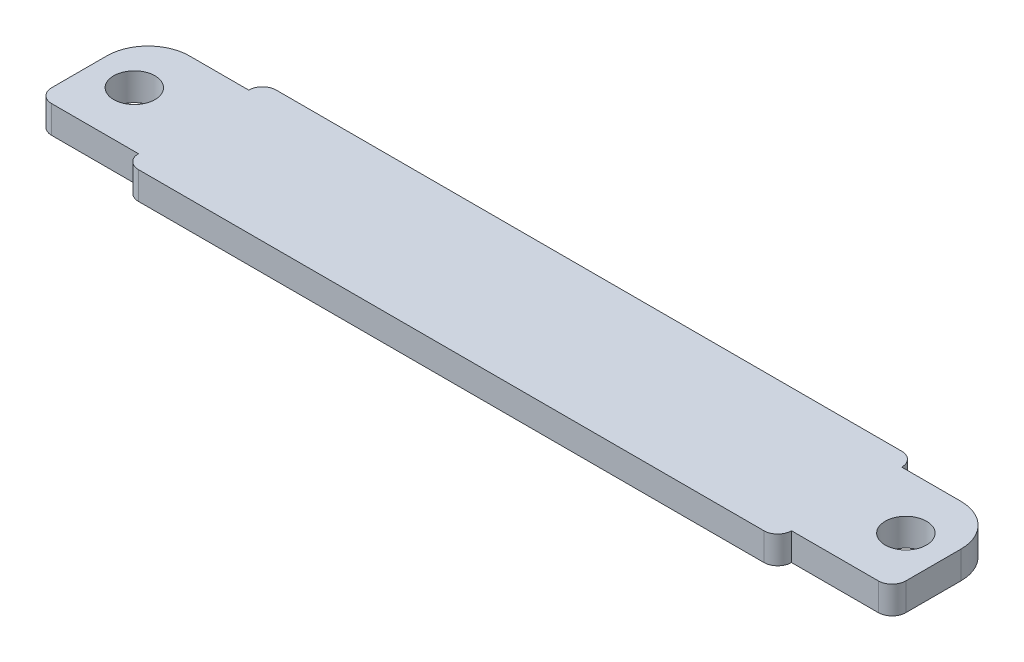
ISO-10303-21;
HEADER;
FILE_DESCRIPTION(('STEP AP214'),'2;1');
FILE_NAME('part.step','',(''),(''),'','','');
FILE_SCHEMA(('AUTOMOTIVE_DESIGN { 1 0 10303 214 1 1 1 1 }'));
ENDSEC;
DATA;
#1=APPLICATION_CONTEXT('core data for automotive mechanical design processes');
#2=APPLICATION_PROTOCOL_DEFINITION('international standard','automotive_design',2000,#1);
#3=PRODUCT_CONTEXT('',#1,'mechanical');
#4=PRODUCT('Part','Part','',(#3));
#5=PRODUCT_RELATED_PRODUCT_CATEGORY('part','',(#4));
#6=PRODUCT_DEFINITION_FORMATION('','',#4);
#7=PRODUCT_DEFINITION_CONTEXT('part definition',#1,'design');
#8=PRODUCT_DEFINITION('design','',#6,#7);
#9=PRODUCT_DEFINITION_SHAPE('','',#8);
#10=(LENGTH_UNIT() NAMED_UNIT(*) SI_UNIT(.MILLI.,.METRE.));
#11=(NAMED_UNIT(*) PLANE_ANGLE_UNIT() SI_UNIT($,.RADIAN.));
#12=(NAMED_UNIT(*) SI_UNIT($,.STERADIAN.) SOLID_ANGLE_UNIT());
#13=UNCERTAINTY_MEASURE_WITH_UNIT(LENGTH_MEASURE(1.E-05),#10,'distance_accuracy_value','');
#14=(GEOMETRIC_REPRESENTATION_CONTEXT(3) GLOBAL_UNCERTAINTY_ASSIGNED_CONTEXT((#13)) GLOBAL_UNIT_ASSIGNED_CONTEXT((#10,
#11,#12)) REPRESENTATION_CONTEXT('',''));
#15=CARTESIAN_POINT('',(0.,0.,0.));
#16=DIRECTION('',(0.,0.,1.));
#17=DIRECTION('',(1.,0.,0.));
#18=AXIS2_PLACEMENT_3D('',#15,#16,#17);
#19=CARTESIAN_POINT('',(0.,2.,0.));
#20=DIRECTION('',(0.,1.,0.));
#21=DIRECTION('',(0.,0.,1.));
#22=AXIS2_PLACEMENT_3D('',#19,#20,#21);
#23=PLANE('',#22);
#24=CARTESIAN_POINT('',(-28.05,2.,0.));
#25=DIRECTION('',(0.,1.,0.));
#26=DIRECTION('',(0.,0.,1.));
#27=AXIS2_PLACEMENT_3D('',#24,#25,#26);
#28=CIRCLE('',#27,1.5);
#29=CARTESIAN_POINT('',(-28.05,2.,1.50000000000001));
#30=VERTEX_POINT('',#29);
#31=EDGE_CURVE('E251',#30,#30,#28,.T.);
#32=ORIENTED_EDGE('',*,*,#31,.F.);
#33=EDGE_LOOP('',(#32));
#34=FACE_BOUND('',#33,.T.);
#35=DIRECTION('',(1.,0.,0.));
#36=VECTOR('',#35,1.);
#37=CARTESIAN_POINT('',(-31.05,2.,4.00000000000001));
#38=LINE('',#37,#36);
#39=CARTESIAN_POINT('',(-30.05,2.,4.00000000000001));
#40=VERTEX_POINT('',#39);
#41=CARTESIAN_POINT('',(-23.75,2.,4.00000000000001));
#42=VERTEX_POINT('',#41);
#43=EDGE_CURVE('E293',#40,#42,#38,.T.);
#44=ORIENTED_EDGE('',*,*,#43,.T.);
#45=CARTESIAN_POINT('',(-22.75,2.,4.));
#46=DIRECTION('',(0.,1.,0.));
#47=DIRECTION('',(0.,0.,1.));
#48=AXIS2_PLACEMENT_3D('',#45,#46,#47);
#49=CIRCLE('',#48,1.);
#50=CARTESIAN_POINT('',(-22.75,2.,5.));
#51=VERTEX_POINT('',#50);
#52=EDGE_CURVE('E158',#42,#51,#49,.T.);
#53=ORIENTED_EDGE('',*,*,#52,.T.);
#54=DIRECTION('',(1.,0.,0.));
#55=VECTOR('',#54,1.);
#56=CARTESIAN_POINT('',(-23.75,2.,5.));
#57=LINE('',#56,#55);
#58=CARTESIAN_POINT('',(22.65,2.,5.));
#59=VERTEX_POINT('',#58);
#60=EDGE_CURVE('E154',#51,#59,#57,.T.);
#61=ORIENTED_EDGE('',*,*,#60,.T.);
#62=CARTESIAN_POINT('',(22.65,2.,4.));
#63=DIRECTION('',(0.,1.,0.));
#64=DIRECTION('',(0.,0.,1.));
#65=AXIS2_PLACEMENT_3D('',#62,#63,#64);
#66=CIRCLE('',#65,1.);
#67=CARTESIAN_POINT('',(23.65,2.,4.));
#68=VERTEX_POINT('',#67);
#69=EDGE_CURVE('E148',#59,#68,#66,.T.);
#70=ORIENTED_EDGE('',*,*,#69,.T.);
#71=DIRECTION('',(1.,0.,0.));
#72=VECTOR('',#71,1.);
#73=CARTESIAN_POINT('',(30.95,2.,4.));
#74=LINE('',#73,#72);
#75=CARTESIAN_POINT('',(29.95,2.,4.));
#76=VERTEX_POINT('',#75);
#77=EDGE_CURVE('E151',#68,#76,#74,.T.);
#78=ORIENTED_EDGE('',*,*,#77,.T.);
#79=CARTESIAN_POINT('',(29.95,2.,3.));
#80=DIRECTION('',(0.,1.,0.));
#81=DIRECTION('',(0.,0.,1.));
#82=AXIS2_PLACEMENT_3D('',#79,#80,#81);
#83=CIRCLE('',#82,1.);
#84=CARTESIAN_POINT('',(30.95,2.,3.));
#85=VERTEX_POINT('',#84);
#86=EDGE_CURVE('E215',#76,#85,#83,.T.);
#87=ORIENTED_EDGE('',*,*,#86,.T.);
#88=DIRECTION('',(0.,0.,-1.));
#89=VECTOR('',#88,1.);
#90=CARTESIAN_POINT('',(30.95,2.,-4.));
#91=LINE('',#90,#89);
#92=CARTESIAN_POINT('',(30.95,2.,-1.));
#93=VERTEX_POINT('',#92);
#94=EDGE_CURVE('E166',#85,#93,#91,.T.);
#95=ORIENTED_EDGE('',*,*,#94,.T.);
#96=CARTESIAN_POINT('',(27.95,2.,-1.));
#97=DIRECTION('',(0.,1.,0.));
#98=DIRECTION('',(0.,0.,1.));
#99=AXIS2_PLACEMENT_3D('',#96,#97,#98);
#100=CIRCLE('',#99,3.);
#101=CARTESIAN_POINT('',(27.95,2.,-4.));
#102=VERTEX_POINT('',#101);
#103=EDGE_CURVE('E189',#93,#102,#100,.T.);
#104=ORIENTED_EDGE('',*,*,#103,.T.);
#105=DIRECTION('',(-1.,0.,0.));
#106=VECTOR('',#105,1.);
#107=CARTESIAN_POINT('',(30.95,2.,-4.));
#108=LINE('',#107,#106);
#109=CARTESIAN_POINT('',(23.65,2.,-4.));
#110=VERTEX_POINT('',#109);
#111=EDGE_CURVE('E300',#102,#110,#108,.T.);
#112=ORIENTED_EDGE('',*,*,#111,.T.);
#113=CARTESIAN_POINT('',(22.65,2.,-4.));
#114=DIRECTION('',(0.,1.,0.));
#115=DIRECTION('',(0.,0.,1.));
#116=AXIS2_PLACEMENT_3D('',#113,#114,#115);
#117=CIRCLE('',#116,1.);
#118=CARTESIAN_POINT('',(22.65,2.,-5.));
#119=VERTEX_POINT('',#118);
#120=EDGE_CURVE('E57',#110,#119,#117,.T.);
#121=ORIENTED_EDGE('',*,*,#120,.T.);
#122=DIRECTION('',(-1.,0.,0.));
#123=VECTOR('',#122,1.);
#124=CARTESIAN_POINT('',(-23.75,2.,-5.));
#125=LINE('',#124,#123);
#126=CARTESIAN_POINT('',(-22.75,2.,-5.));
#127=VERTEX_POINT('',#126);
#128=EDGE_CURVE('E296',#119,#127,#125,.T.);
#129=ORIENTED_EDGE('',*,*,#128,.T.);
#130=CARTESIAN_POINT('',(-22.75,2.,-4.));
#131=DIRECTION('',(0.,1.,0.));
#132=DIRECTION('',(0.,0.,1.));
#133=AXIS2_PLACEMENT_3D('',#130,#131,#132);
#134=CIRCLE('',#133,1.);
#135=CARTESIAN_POINT('',(-23.75,2.,-3.99999999999999));
#136=VERTEX_POINT('',#135);
#137=EDGE_CURVE('E219',#127,#136,#134,.T.);
#138=ORIENTED_EDGE('',*,*,#137,.T.);
#139=DIRECTION('',(-1.,0.,0.));
#140=VECTOR('',#139,1.);
#141=CARTESIAN_POINT('',(-31.05,2.,-3.99999999999999));
#142=LINE('',#141,#140);
#143=CARTESIAN_POINT('',(-28.05,2.,-3.99999999999999));
#144=VERTEX_POINT('',#143);
#145=EDGE_CURVE('E277',#136,#144,#142,.T.);
#146=ORIENTED_EDGE('',*,*,#145,.T.);
#147=CARTESIAN_POINT('',(-28.05,2.,-0.999999999999993));
#148=DIRECTION('',(0.,1.,0.));
#149=DIRECTION('',(0.,0.,1.));
#150=AXIS2_PLACEMENT_3D('',#147,#148,#149);
#151=CIRCLE('',#150,3.);
#152=CARTESIAN_POINT('',(-31.05,2.,-0.999999999999993));
#153=VERTEX_POINT('',#152);
#154=EDGE_CURVE('E191',#144,#153,#151,.T.);
#155=ORIENTED_EDGE('',*,*,#154,.T.);
#156=DIRECTION('',(0.,0.,1.));
#157=VECTOR('',#156,1.);
#158=CARTESIAN_POINT('',(-31.05,2.,-3.99999999999999));
#159=LINE('',#158,#157);
#160=CARTESIAN_POINT('',(-31.05,2.,3.00000000000001));
#161=VERTEX_POINT('',#160);
#162=EDGE_CURVE('E291',#153,#161,#159,.T.);
#163=ORIENTED_EDGE('',*,*,#162,.T.);
#164=CARTESIAN_POINT('',(-30.05,2.,3.00000000000001));
#165=DIRECTION('',(0.,1.,0.));
#166=DIRECTION('',(0.,0.,1.));
#167=AXIS2_PLACEMENT_3D('',#164,#165,#166);
#168=CIRCLE('',#167,1.);
#169=EDGE_CURVE('E217',#161,#40,#168,.T.);
#170=ORIENTED_EDGE('',*,*,#169,.T.);
#171=EDGE_LOOP('',(#44,#53,#61,#70,#78,#87,#95,#104,#112,#121,#129,#138,#146,#155,#163,#170));
#172=FACE_BOUND('',#171,.T.);
#173=CARTESIAN_POINT('',(27.95,2.,0.));
#174=DIRECTION('',(0.,1.,0.));
#175=DIRECTION('',(0.,0.,1.));
#176=AXIS2_PLACEMENT_3D('',#173,#174,#175);
#177=CIRCLE('',#176,1.5);
#178=CARTESIAN_POINT('',(27.95,2.,1.5));
#179=VERTEX_POINT('',#178);
#180=EDGE_CURVE('E306',#179,#179,#177,.T.);
#181=ORIENTED_EDGE('',*,*,#180,.F.);
#182=EDGE_LOOP('',(#181));
#183=FACE_BOUND('',#182,.T.);
#184=ADVANCED_FACE('F35',(#34,#172,#183),#23,.T.);
#185=CARTESIAN_POINT('',(0.,0.,0.));
#186=DIRECTION('',(0.,1.,0.));
#187=DIRECTION('',(0.,0.,1.));
#188=AXIS2_PLACEMENT_3D('',#185,#186,#187);
#189=PLANE('',#188);
#190=DIRECTION('',(1.,0.,0.));
#191=VECTOR('',#190,1.);
#192=CARTESIAN_POINT('',(-23.75,0.,5.));
#193=LINE('',#192,#191);
#194=CARTESIAN_POINT('',(-22.75,0.,5.));
#195=VERTEX_POINT('',#194);
#196=CARTESIAN_POINT('',(22.65,0.,5.));
#197=VERTEX_POINT('',#196);
#198=EDGE_CURVE('E167',#195,#197,#193,.T.);
#199=ORIENTED_EDGE('',*,*,#198,.F.);
#200=CARTESIAN_POINT('',(-22.75,0.,4.));
#201=DIRECTION('',(0.,1.,0.));
#202=DIRECTION('',(0.,0.,1.));
#203=AXIS2_PLACEMENT_3D('',#200,#201,#202);
#204=CIRCLE('',#203,1.);
#205=CARTESIAN_POINT('',(-23.75,0.,4.00000000000001));
#206=VERTEX_POINT('',#205);
#207=EDGE_CURVE('E213',#195,#206,#204,.F.);
#208=ORIENTED_EDGE('',*,*,#207,.T.);
#209=DIRECTION('',(1.,0.,0.));
#210=VECTOR('',#209,1.);
#211=CARTESIAN_POINT('',(-31.05,0.,4.00000000000001));
#212=LINE('',#211,#210);
#213=CARTESIAN_POINT('',(-30.05,0.,4.00000000000001));
#214=VERTEX_POINT('',#213);
#215=EDGE_CURVE('E262',#214,#206,#212,.T.);
#216=ORIENTED_EDGE('',*,*,#215,.F.);
#217=CARTESIAN_POINT('',(-30.05,0.,3.00000000000001));
#218=DIRECTION('',(0.,1.,0.));
#219=DIRECTION('',(0.,0.,1.));
#220=AXIS2_PLACEMENT_3D('',#217,#218,#219);
#221=CIRCLE('',#220,1.);
#222=CARTESIAN_POINT('',(-31.05,0.,3.00000000000001));
#223=VERTEX_POINT('',#222);
#224=EDGE_CURVE('E206',#214,#223,#221,.F.);
#225=ORIENTED_EDGE('',*,*,#224,.T.);
#226=DIRECTION('',(0.,0.,1.));
#227=VECTOR('',#226,1.);
#228=CARTESIAN_POINT('',(-31.05,0.,-3.99999999999999));
#229=LINE('',#228,#227);
#230=CARTESIAN_POINT('',(-31.05,0.,-0.999999999999993));
#231=VERTEX_POINT('',#230);
#232=EDGE_CURVE('E259',#231,#223,#229,.T.);
#233=ORIENTED_EDGE('',*,*,#232,.F.);
#234=CARTESIAN_POINT('',(-28.05,0.,-0.999999999999993));
#235=DIRECTION('',(0.,1.,0.));
#236=DIRECTION('',(0.,0.,1.));
#237=AXIS2_PLACEMENT_3D('',#234,#235,#236);
#238=CIRCLE('',#237,3.);
#239=CARTESIAN_POINT('',(-28.05,0.,-3.99999999999999));
#240=VERTEX_POINT('',#239);
#241=EDGE_CURVE('E185',#231,#240,#238,.F.);
#242=ORIENTED_EDGE('',*,*,#241,.T.);
#243=DIRECTION('',(-1.,0.,0.));
#244=VECTOR('',#243,1.);
#245=CARTESIAN_POINT('',(-31.05,0.,-3.99999999999999));
#246=LINE('',#245,#244);
#247=CARTESIAN_POINT('',(-23.75,0.,-3.99999999999999));
#248=VERTEX_POINT('',#247);
#249=EDGE_CURVE('E256',#248,#240,#246,.T.);
#250=ORIENTED_EDGE('',*,*,#249,.F.);
#251=CARTESIAN_POINT('',(-22.75,0.,-4.));
#252=DIRECTION('',(0.,1.,0.));
#253=DIRECTION('',(0.,0.,1.));
#254=AXIS2_PLACEMENT_3D('',#251,#252,#253);
#255=CIRCLE('',#254,1.);
#256=CARTESIAN_POINT('',(-22.75,0.,-5.));
#257=VERTEX_POINT('',#256);
#258=EDGE_CURVE('E208',#248,#257,#255,.F.);
#259=ORIENTED_EDGE('',*,*,#258,.T.);
#260=DIRECTION('',(-1.,0.,0.));
#261=VECTOR('',#260,1.);
#262=CARTESIAN_POINT('',(-23.75,0.,-5.));
#263=LINE('',#262,#261);
#264=CARTESIAN_POINT('',(22.65,0.,-5.));
#265=VERTEX_POINT('',#264);
#266=EDGE_CURVE('E249',#265,#257,#263,.T.);
#267=ORIENTED_EDGE('',*,*,#266,.F.);
#268=CARTESIAN_POINT('',(22.65,0.,-4.));
#269=DIRECTION('',(0.,1.,0.));
#270=DIRECTION('',(0.,0.,1.));
#271=AXIS2_PLACEMENT_3D('',#268,#269,#270);
#272=CIRCLE('',#271,1.);
#273=CARTESIAN_POINT('',(23.65,0.,-4.));
#274=VERTEX_POINT('',#273);
#275=EDGE_CURVE('E210',#265,#274,#272,.F.);
#276=ORIENTED_EDGE('',*,*,#275,.T.);
#277=DIRECTION('',(-1.,0.,0.));
#278=VECTOR('',#277,1.);
#279=CARTESIAN_POINT('',(30.95,0.,-4.));
#280=LINE('',#279,#278);
#281=CARTESIAN_POINT('',(27.95,0.,-4.));
#282=VERTEX_POINT('',#281);
#283=EDGE_CURVE('E245',#282,#274,#280,.T.);
#284=ORIENTED_EDGE('',*,*,#283,.F.);
#285=CARTESIAN_POINT('',(27.95,0.,-1.));
#286=DIRECTION('',(0.,1.,0.));
#287=DIRECTION('',(0.,0.,1.));
#288=AXIS2_PLACEMENT_3D('',#285,#286,#287);
#289=CIRCLE('',#288,3.);
#290=CARTESIAN_POINT('',(30.95,0.,-1.));
#291=VERTEX_POINT('',#290);
#292=EDGE_CURVE('E176',#282,#291,#289,.F.);
#293=ORIENTED_EDGE('',*,*,#292,.T.);
#294=DIRECTION('',(0.,0.,-1.));
#295=VECTOR('',#294,1.);
#296=CARTESIAN_POINT('',(30.95,0.,-4.));
#297=LINE('',#296,#295);
#298=CARTESIAN_POINT('',(30.95,0.,3.));
#299=VERTEX_POINT('',#298);
#300=EDGE_CURVE('E237',#299,#291,#297,.T.);
#301=ORIENTED_EDGE('',*,*,#300,.F.);
#302=CARTESIAN_POINT('',(29.95,0.,3.));
#303=DIRECTION('',(0.,1.,0.));
#304=DIRECTION('',(0.,0.,1.));
#305=AXIS2_PLACEMENT_3D('',#302,#303,#304);
#306=CIRCLE('',#305,1.);
#307=CARTESIAN_POINT('',(29.95,0.,4.));
#308=VERTEX_POINT('',#307);
#309=EDGE_CURVE('E204',#299,#308,#306,.F.);
#310=ORIENTED_EDGE('',*,*,#309,.T.);
#311=DIRECTION('',(1.,0.,0.));
#312=VECTOR('',#311,1.);
#313=CARTESIAN_POINT('',(30.95,0.,4.));
#314=LINE('',#313,#312);
#315=CARTESIAN_POINT('',(23.65,0.,4.));
#316=VERTEX_POINT('',#315);
#317=EDGE_CURVE('E246',#316,#308,#314,.T.);
#318=ORIENTED_EDGE('',*,*,#317,.F.);
#319=CARTESIAN_POINT('',(22.65,0.,4.));
#320=DIRECTION('',(0.,1.,0.));
#321=DIRECTION('',(0.,0.,1.));
#322=AXIS2_PLACEMENT_3D('',#319,#320,#321);
#323=CIRCLE('',#322,1.);
#324=EDGE_CURVE('E170',#316,#197,#323,.F.);
#325=ORIENTED_EDGE('',*,*,#324,.T.);
#326=EDGE_LOOP('',(#199,#208,#216,#225,#233,#242,#250,#259,#267,#276,#284,#293,#301,#310,#318,#325));
#327=FACE_BOUND('',#326,.T.);
#328=CARTESIAN_POINT('',(-28.05,0.,0.));
#329=DIRECTION('',(0.,1.,0.));
#330=DIRECTION('',(0.,0.,1.));
#331=AXIS2_PLACEMENT_3D('',#328,#329,#330);
#332=CIRCLE('',#331,1.5);
#333=CARTESIAN_POINT('',(-28.05,0.,1.50000000000001));
#334=VERTEX_POINT('',#333);
#335=EDGE_CURVE('E303',#334,#334,#332,.T.);
#336=ORIENTED_EDGE('',*,*,#335,.T.);
#337=EDGE_LOOP('',(#336));
#338=FACE_BOUND('',#337,.T.);
#339=CARTESIAN_POINT('',(27.95,0.,0.));
#340=DIRECTION('',(0.,1.,0.));
#341=DIRECTION('',(0.,0.,1.));
#342=AXIS2_PLACEMENT_3D('',#339,#340,#341);
#343=CIRCLE('',#342,1.5);
#344=CARTESIAN_POINT('',(27.95,0.,1.5));
#345=VERTEX_POINT('',#344);
#346=EDGE_CURVE('E309',#345,#345,#343,.T.);
#347=ORIENTED_EDGE('',*,*,#346,.T.);
#348=EDGE_LOOP('',(#347));
#349=FACE_BOUND('',#348,.T.);
#350=ADVANCED_FACE('F241',(#327,#338,#349),#189,.F.);
#351=CARTESIAN_POINT('',(30.95,2.,4.));
#352=DIRECTION('',(0.,0.,-1.));
#353=DIRECTION('',(-1.,0.,0.));
#354=AXIS2_PLACEMENT_3D('',#351,#352,#353);
#355=PLANE('',#354);
#356=ORIENTED_EDGE('',*,*,#317,.T.);
#357=DIRECTION('',(0.,-1.,0.));
#358=VECTOR('',#357,1.);
#359=CARTESIAN_POINT('',(29.95,2.,4.));
#360=LINE('',#359,#358);
#361=EDGE_CURVE('E11',#308,#76,#360,.F.);
#362=ORIENTED_EDGE('',*,*,#361,.T.);
#363=ORIENTED_EDGE('',*,*,#77,.F.);
#364=DIRECTION('',(0.,-1.,0.));
#365=VECTOR('',#364,1.);
#366=CARTESIAN_POINT('',(23.65,2.,4.));
#367=LINE('',#366,#365);
#368=EDGE_CURVE('E164',#68,#316,#367,.T.);
#369=ORIENTED_EDGE('',*,*,#368,.T.);
#370=EDGE_LOOP('',(#356,#362,#363,#369));
#371=FACE_BOUND('',#370,.T.);
#372=ADVANCED_FACE('F163',(#371),#355,.F.);
#373=CARTESIAN_POINT('',(30.95,2.,-4.));
#374=DIRECTION('',(-1.,0.,0.));
#375=DIRECTION('',(0.,0.,1.));
#376=AXIS2_PLACEMENT_3D('',#373,#374,#375);
#377=PLANE('',#376);
#378=ORIENTED_EDGE('',*,*,#94,.F.);
#379=DIRECTION('',(0.,-1.,0.));
#380=VECTOR('',#379,1.);
#381=CARTESIAN_POINT('',(30.95,2.,3.));
#382=LINE('',#381,#380);
#383=EDGE_CURVE('E43',#85,#299,#382,.T.);
#384=ORIENTED_EDGE('',*,*,#383,.T.);
#385=ORIENTED_EDGE('',*,*,#300,.T.);
#386=DIRECTION('',(0.,-1.,0.));
#387=VECTOR('',#386,1.);
#388=CARTESIAN_POINT('',(30.95,2.,-1.));
#389=LINE('',#388,#387);
#390=EDGE_CURVE('E196',#291,#93,#389,.F.);
#391=ORIENTED_EDGE('',*,*,#390,.T.);
#392=EDGE_LOOP('',(#378,#384,#385,#391));
#393=FACE_BOUND('',#392,.T.);
#394=ADVANCED_FACE('F236',(#393),#377,.F.);
#395=CARTESIAN_POINT('',(30.95,2.,-4.));
#396=DIRECTION('',(0.,0.,1.));
#397=DIRECTION('',(1.,0.,0.));
#398=AXIS2_PLACEMENT_3D('',#395,#396,#397);
#399=PLANE('',#398);
#400=ORIENTED_EDGE('',*,*,#111,.F.);
#401=DIRECTION('',(0.,-1.,0.));
#402=VECTOR('',#401,1.);
#403=CARTESIAN_POINT('',(27.95,2.,-4.));
#404=LINE('',#403,#402);
#405=EDGE_CURVE('E193',#102,#282,#404,.T.);
#406=ORIENTED_EDGE('',*,*,#405,.T.);
#407=ORIENTED_EDGE('',*,*,#283,.T.);
#408=DIRECTION('',(0.,-1.,0.));
#409=VECTOR('',#408,1.);
#410=CARTESIAN_POINT('',(23.65,2.,-4.));
#411=LINE('',#410,#409);
#412=EDGE_CURVE('E173',#110,#274,#411,.T.);
#413=ORIENTED_EDGE('',*,*,#412,.F.);
#414=EDGE_LOOP('',(#400,#406,#407,#413));
#415=FACE_BOUND('',#414,.T.);
#416=ADVANCED_FACE('F344',(#415),#399,.F.);
#417=CARTESIAN_POINT('',(-23.75,2.,-5.));
#418=DIRECTION('',(0.,0.,1.));
#419=DIRECTION('',(1.,0.,0.));
#420=AXIS2_PLACEMENT_3D('',#417,#418,#419);
#421=PLANE('',#420);
#422=ORIENTED_EDGE('',*,*,#128,.F.);
#423=DIRECTION('',(0.,-1.,0.));
#424=VECTOR('',#423,1.);
#425=CARTESIAN_POINT('',(22.65,2.,-5.));
#426=LINE('',#425,#424);
#427=EDGE_CURVE('E224',#119,#265,#426,.T.);
#428=ORIENTED_EDGE('',*,*,#427,.T.);
#429=ORIENTED_EDGE('',*,*,#266,.T.);
#430=DIRECTION('',(0.,-1.,0.));
#431=VECTOR('',#430,1.);
#432=CARTESIAN_POINT('',(-22.75,2.,-5.));
#433=LINE('',#432,#431);
#434=EDGE_CURVE('E50',#257,#127,#433,.F.);
#435=ORIENTED_EDGE('',*,*,#434,.T.);
#436=EDGE_LOOP('',(#422,#428,#429,#435));
#437=FACE_BOUND('',#436,.T.);
#438=ADVANCED_FACE('F341',(#437),#421,.F.);
#439=CARTESIAN_POINT('',(-31.05,2.,-3.99999999999999));
#440=DIRECTION('',(0.,0.,1.));
#441=DIRECTION('',(1.,0.,0.));
#442=AXIS2_PLACEMENT_3D('',#439,#440,#441);
#443=PLANE('',#442);
#444=ORIENTED_EDGE('',*,*,#249,.T.);
#445=DIRECTION('',(0.,-1.,0.));
#446=VECTOR('',#445,1.);
#447=CARTESIAN_POINT('',(-28.05,2.,-3.99999999999999));
#448=LINE('',#447,#446);
#449=EDGE_CURVE('E187',#240,#144,#448,.F.);
#450=ORIENTED_EDGE('',*,*,#449,.T.);
#451=ORIENTED_EDGE('',*,*,#145,.F.);
#452=DIRECTION('',(0.,-1.,0.));
#453=VECTOR('',#452,1.);
#454=CARTESIAN_POINT('',(-23.75,2.,-3.99999999999999));
#455=LINE('',#454,#453);
#456=EDGE_CURVE('E179',#136,#248,#455,.T.);
#457=ORIENTED_EDGE('',*,*,#456,.T.);
#458=EDGE_LOOP('',(#444,#450,#451,#457));
#459=FACE_BOUND('',#458,.T.);
#460=ADVANCED_FACE('F274',(#459),#443,.F.);
#461=CARTESIAN_POINT('',(-31.05,2.,-3.99999999999999));
#462=DIRECTION('',(1.,0.,0.));
#463=DIRECTION('',(0.,0.,-1.));
#464=AXIS2_PLACEMENT_3D('',#461,#462,#463);
#465=PLANE('',#464);
#466=ORIENTED_EDGE('',*,*,#232,.T.);
#467=DIRECTION('',(0.,-1.,0.));
#468=VECTOR('',#467,1.);
#469=CARTESIAN_POINT('',(-31.05,2.,3.00000000000001));
#470=LINE('',#469,#468);
#471=EDGE_CURVE('E230',#223,#161,#470,.F.);
#472=ORIENTED_EDGE('',*,*,#471,.T.);
#473=ORIENTED_EDGE('',*,*,#162,.F.);
#474=DIRECTION('',(0.,-1.,0.));
#475=VECTOR('',#474,1.);
#476=CARTESIAN_POINT('',(-31.05,2.,-0.999999999999993));
#477=LINE('',#476,#475);
#478=EDGE_CURVE('E172',#153,#231,#477,.T.);
#479=ORIENTED_EDGE('',*,*,#478,.T.);
#480=EDGE_LOOP('',(#466,#472,#473,#479));
#481=FACE_BOUND('',#480,.T.);
#482=ADVANCED_FACE('F288',(#481),#465,.F.);
#483=CARTESIAN_POINT('',(-31.05,2.,4.00000000000001));
#484=DIRECTION('',(0.,0.,-1.));
#485=DIRECTION('',(-1.,0.,0.));
#486=AXIS2_PLACEMENT_3D('',#483,#484,#485);
#487=PLANE('',#486);
#488=ORIENTED_EDGE('',*,*,#43,.F.);
#489=DIRECTION('',(0.,-1.,0.));
#490=VECTOR('',#489,1.);
#491=CARTESIAN_POINT('',(-30.05,2.,4.00000000000001));
#492=LINE('',#491,#490);
#493=EDGE_CURVE('E227',#40,#214,#492,.T.);
#494=ORIENTED_EDGE('',*,*,#493,.T.);
#495=ORIENTED_EDGE('',*,*,#215,.T.);
#496=DIRECTION('',(0.,-1.,0.));
#497=VECTOR('',#496,1.);
#498=CARTESIAN_POINT('',(-23.75,2.,4.00000000000001));
#499=LINE('',#498,#497);
#500=EDGE_CURVE('E267',#42,#206,#499,.T.);
#501=ORIENTED_EDGE('',*,*,#500,.F.);
#502=EDGE_LOOP('',(#488,#494,#495,#501));
#503=FACE_BOUND('',#502,.T.);
#504=ADVANCED_FACE('F332',(#503),#487,.F.);
#505=CARTESIAN_POINT('',(-23.75,2.,5.));
#506=DIRECTION('',(0.,0.,-1.));
#507=DIRECTION('',(-1.,0.,0.));
#508=AXIS2_PLACEMENT_3D('',#505,#506,#507);
#509=PLANE('',#508);
#510=ORIENTED_EDGE('',*,*,#60,.F.);
#511=DIRECTION('',(0.,-1.,0.));
#512=VECTOR('',#511,1.);
#513=CARTESIAN_POINT('',(-22.75,2.,5.));
#514=LINE('',#513,#512);
#515=EDGE_CURVE('E201',#51,#195,#514,.T.);
#516=ORIENTED_EDGE('',*,*,#515,.T.);
#517=ORIENTED_EDGE('',*,*,#198,.T.);
#518=DIRECTION('',(0.,-1.,0.));
#519=VECTOR('',#518,1.);
#520=CARTESIAN_POINT('',(22.65,2.,5.));
#521=LINE('',#520,#519);
#522=EDGE_CURVE('E199',#197,#59,#521,.F.);
#523=ORIENTED_EDGE('',*,*,#522,.T.);
#524=EDGE_LOOP('',(#510,#516,#517,#523));
#525=FACE_BOUND('',#524,.T.);
#526=ADVANCED_FACE('F329',(#525),#509,.F.);
#527=CARTESIAN_POINT('',(-28.05,2.,0.));
#528=DIRECTION('',(0.,-1.,0.));
#529=DIRECTION('',(0.,0.,-1.));
#530=AXIS2_PLACEMENT_3D('',#527,#528,#529);
#531=CYLINDRICAL_SURFACE('',#530,1.5);
#532=ORIENTED_EDGE('',*,*,#31,.T.);
#533=EDGE_LOOP('',(#532));
#534=FACE_BOUND('',#533,.T.);
#535=ORIENTED_EDGE('',*,*,#335,.F.);
#536=EDGE_LOOP('',(#535));
#537=FACE_BOUND('',#536,.T.);
#538=ADVANCED_FACE('F326',(#534,#537),#531,.F.);
#539=CARTESIAN_POINT('',(27.95,2.,0.));
#540=DIRECTION('',(0.,-1.,0.));
#541=DIRECTION('',(0.,0.,-1.));
#542=AXIS2_PLACEMENT_3D('',#539,#540,#541);
#543=CYLINDRICAL_SURFACE('',#542,1.5);
#544=ORIENTED_EDGE('',*,*,#180,.T.);
#545=EDGE_LOOP('',(#544));
#546=FACE_BOUND('',#545,.T.);
#547=ORIENTED_EDGE('',*,*,#346,.F.);
#548=EDGE_LOOP('',(#547));
#549=FACE_BOUND('',#548,.T.);
#550=ADVANCED_FACE('F315',(#546,#549),#543,.F.);
#551=CARTESIAN_POINT('',(-28.05,2.,-0.999999999999993));
#552=DIRECTION('',(0.,-1.,0.));
#553=DIRECTION('',(0.,0.,-1.));
#554=AXIS2_PLACEMENT_3D('',#551,#552,#553);
#555=CYLINDRICAL_SURFACE('',#554,3.);
#556=ORIENTED_EDGE('',*,*,#154,.F.);
#557=ORIENTED_EDGE('',*,*,#449,.F.);
#558=ORIENTED_EDGE('',*,*,#241,.F.);
#559=ORIENTED_EDGE('',*,*,#478,.F.);
#560=EDGE_LOOP('',(#556,#557,#558,#559));
#561=FACE_BOUND('',#560,.T.);
#562=ADVANCED_FACE('F285',(#561),#555,.T.);
#563=CARTESIAN_POINT('',(27.95,2.,-1.));
#564=DIRECTION('',(0.,-1.,0.));
#565=DIRECTION('',(0.,0.,-1.));
#566=AXIS2_PLACEMENT_3D('',#563,#564,#565);
#567=CYLINDRICAL_SURFACE('',#566,3.);
#568=ORIENTED_EDGE('',*,*,#103,.F.);
#569=ORIENTED_EDGE('',*,*,#390,.F.);
#570=ORIENTED_EDGE('',*,*,#292,.F.);
#571=ORIENTED_EDGE('',*,*,#405,.F.);
#572=EDGE_LOOP('',(#568,#569,#570,#571));
#573=FACE_BOUND('',#572,.T.);
#574=ADVANCED_FACE('F354',(#573),#567,.T.);
#575=CARTESIAN_POINT('',(-22.75,2.,4.));
#576=DIRECTION('',(0.,-1.,0.));
#577=DIRECTION('',(0.,0.,-1.));
#578=AXIS2_PLACEMENT_3D('',#575,#576,#577);
#579=CYLINDRICAL_SURFACE('',#578,1.);
#580=ORIENTED_EDGE('',*,*,#52,.F.);
#581=ORIENTED_EDGE('',*,*,#500,.T.);
#582=ORIENTED_EDGE('',*,*,#207,.F.);
#583=ORIENTED_EDGE('',*,*,#515,.F.);
#584=EDGE_LOOP('',(#580,#581,#582,#583));
#585=FACE_BOUND('',#584,.T.);
#586=ADVANCED_FACE('F357',(#585),#579,.T.);
#587=CARTESIAN_POINT('',(22.65,2.,4.));
#588=DIRECTION('',(0.,-1.,0.));
#589=DIRECTION('',(0.,0.,-1.));
#590=AXIS2_PLACEMENT_3D('',#587,#588,#589);
#591=CYLINDRICAL_SURFACE('',#590,1.);
#592=ORIENTED_EDGE('',*,*,#69,.F.);
#593=ORIENTED_EDGE('',*,*,#522,.F.);
#594=ORIENTED_EDGE('',*,*,#324,.F.);
#595=ORIENTED_EDGE('',*,*,#368,.F.);
#596=EDGE_LOOP('',(#592,#593,#594,#595));
#597=FACE_BOUND('',#596,.T.);
#598=ADVANCED_FACE('F169',(#597),#591,.T.);
#599=CARTESIAN_POINT('',(22.65,2.,-4.));
#600=DIRECTION('',(0.,-1.,0.));
#601=DIRECTION('',(0.,0.,-1.));
#602=AXIS2_PLACEMENT_3D('',#599,#600,#601);
#603=CYLINDRICAL_SURFACE('',#602,1.);
#604=ORIENTED_EDGE('',*,*,#120,.F.);
#605=ORIENTED_EDGE('',*,*,#412,.T.);
#606=ORIENTED_EDGE('',*,*,#275,.F.);
#607=ORIENTED_EDGE('',*,*,#427,.F.);
#608=EDGE_LOOP('',(#604,#605,#606,#607));
#609=FACE_BOUND('',#608,.T.);
#610=ADVANCED_FACE('F364',(#609),#603,.T.);
#611=CARTESIAN_POINT('',(-22.75,2.,-4.));
#612=DIRECTION('',(0.,-1.,0.));
#613=DIRECTION('',(0.,0.,-1.));
#614=AXIS2_PLACEMENT_3D('',#611,#612,#613);
#615=CYLINDRICAL_SURFACE('',#614,1.);
#616=ORIENTED_EDGE('',*,*,#137,.F.);
#617=ORIENTED_EDGE('',*,*,#434,.F.);
#618=ORIENTED_EDGE('',*,*,#258,.F.);
#619=ORIENTED_EDGE('',*,*,#456,.F.);
#620=EDGE_LOOP('',(#616,#617,#618,#619));
#621=FACE_BOUND('',#620,.T.);
#622=ADVANCED_FACE('F367',(#621),#615,.T.);
#623=CARTESIAN_POINT('',(-30.05,2.,3.00000000000001));
#624=DIRECTION('',(0.,-1.,0.));
#625=DIRECTION('',(0.,0.,-1.));
#626=AXIS2_PLACEMENT_3D('',#623,#624,#625);
#627=CYLINDRICAL_SURFACE('',#626,1.);
#628=ORIENTED_EDGE('',*,*,#169,.F.);
#629=ORIENTED_EDGE('',*,*,#471,.F.);
#630=ORIENTED_EDGE('',*,*,#224,.F.);
#631=ORIENTED_EDGE('',*,*,#493,.F.);
#632=EDGE_LOOP('',(#628,#629,#630,#631));
#633=FACE_BOUND('',#632,.T.);
#634=ADVANCED_FACE('F370',(#633),#627,.T.);
#635=CARTESIAN_POINT('',(29.95,2.,3.));
#636=DIRECTION('',(0.,-1.,0.));
#637=DIRECTION('',(0.,0.,-1.));
#638=AXIS2_PLACEMENT_3D('',#635,#636,#637);
#639=CYLINDRICAL_SURFACE('',#638,1.);
#640=ORIENTED_EDGE('',*,*,#86,.F.);
#641=ORIENTED_EDGE('',*,*,#361,.F.);
#642=ORIENTED_EDGE('',*,*,#309,.F.);
#643=ORIENTED_EDGE('',*,*,#383,.F.);
#644=EDGE_LOOP('',(#640,#641,#642,#643));
#645=FACE_BOUND('',#644,.T.);
#646=ADVANCED_FACE('F37',(#645),#639,.T.);
#647=CLOSED_SHELL('',(#184,#350,#372,#394,#416,#438,#460,#482,#504,#526,#538,#550,#562,#574,
#586,#598,#610,#622,#634,#646));
#648=MANIFOLD_SOLID_BREP('B2',#647);
#649=ADVANCED_BREP_SHAPE_REPRESENTATION('',(#18,#648),#14);
#650=SHAPE_DEFINITION_REPRESENTATION(#9,#649);
ENDSEC;
END-ISO-10303-21;
